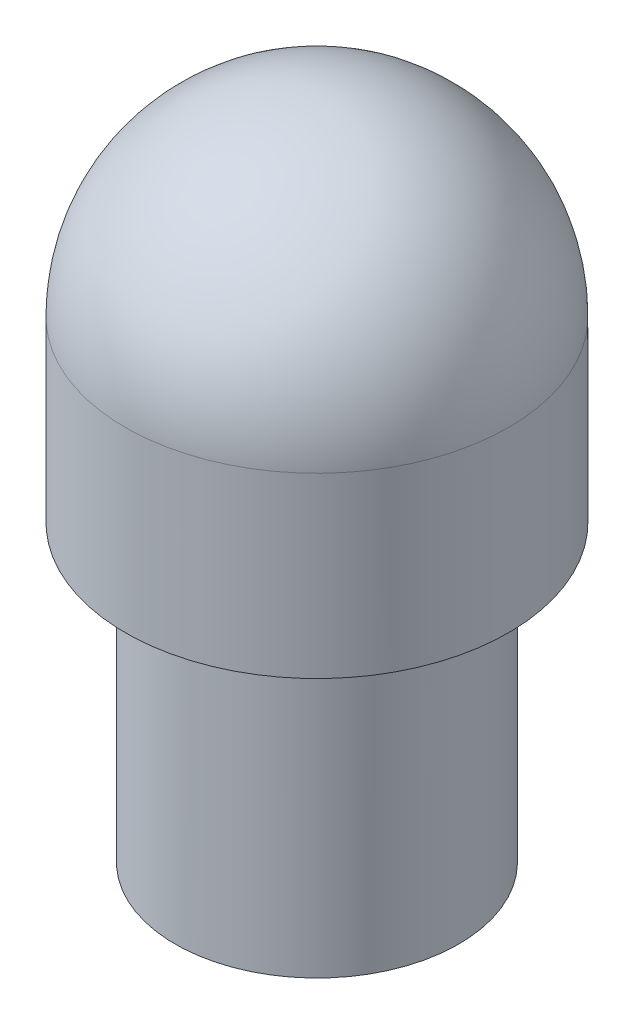
ISO-10303-21;
HEADER;
FILE_DESCRIPTION(('STEP AP214'),'2;1');
FILE_NAME('part.step','',(''),(''),'','','');
FILE_SCHEMA(('AUTOMOTIVE_DESIGN { 1 0 10303 214 1 1 1 1 }'));
ENDSEC;
DATA;
#1=APPLICATION_CONTEXT('core data for automotive mechanical design processes');
#2=APPLICATION_PROTOCOL_DEFINITION('international standard','automotive_design',2000,#1);
#3=PRODUCT_CONTEXT('',#1,'mechanical');
#4=PRODUCT('Part','Part','',(#3));
#5=PRODUCT_RELATED_PRODUCT_CATEGORY('part','',(#4));
#6=PRODUCT_DEFINITION_FORMATION('','',#4);
#7=PRODUCT_DEFINITION_CONTEXT('part definition',#1,'design');
#8=PRODUCT_DEFINITION('design','',#6,#7);
#9=PRODUCT_DEFINITION_SHAPE('','',#8);
#10=(LENGTH_UNIT() NAMED_UNIT(*) SI_UNIT(.MILLI.,.METRE.));
#11=(NAMED_UNIT(*) PLANE_ANGLE_UNIT() SI_UNIT($,.RADIAN.));
#12=(NAMED_UNIT(*) SI_UNIT($,.STERADIAN.) SOLID_ANGLE_UNIT());
#13=UNCERTAINTY_MEASURE_WITH_UNIT(LENGTH_MEASURE(1.E-05),#10,'distance_accuracy_value','');
#14=(GEOMETRIC_REPRESENTATION_CONTEXT(3) GLOBAL_UNCERTAINTY_ASSIGNED_CONTEXT((#13)) GLOBAL_UNIT_ASSIGNED_CONTEXT((#10,
#11,#12)) REPRESENTATION_CONTEXT('',''));
#15=CARTESIAN_POINT('',(0.,0.,0.));
#16=DIRECTION('',(0.,0.,1.));
#17=DIRECTION('',(1.,0.,0.));
#18=AXIS2_PLACEMENT_3D('',#15,#16,#17);
#19=CARTESIAN_POINT('',(-3.899,25.4,0.));
#20=DIRECTION('',(0.,1.,0.));
#21=DIRECTION('',(0.,0.,1.));
#22=AXIS2_PLACEMENT_3D('',#19,#20,#21);
#23=PLANE('',#22);
#24=CARTESIAN_POINT('',(0.,25.4,0.));
#25=DIRECTION('',(0.,-1.,0.));
#26=DIRECTION('',(0.,0.,-1.));
#27=AXIS2_PLACEMENT_3D('',#24,#25,#26);
#28=CIRCLE('',#27,3.5);
#29=CARTESIAN_POINT('',(0.,25.4,-3.5));
#30=VERTEX_POINT('',#29);
#31=EDGE_CURVE('E80',#30,#30,#28,.T.);
#32=ORIENTED_EDGE('',*,*,#31,.F.);
#33=EDGE_LOOP('',(#32));
#34=FACE_BOUND('',#33,.T.);
#35=CARTESIAN_POINT('',(0.,25.4,0.));
#36=DIRECTION('',(0.,-1.,0.));
#37=DIRECTION('',(0.,0.,-1.));
#38=AXIS2_PLACEMENT_3D('',#35,#36,#37);
#39=CIRCLE('',#38,3.899);
#40=CARTESIAN_POINT('',(0.,25.4,-3.899));
#41=VERTEX_POINT('',#40);
#42=EDGE_CURVE('E70',#41,#41,#39,.T.);
#43=ORIENTED_EDGE('',*,*,#42,.T.);
#44=EDGE_LOOP('',(#43));
#45=FACE_BOUND('',#44,.T.);
#46=ADVANCED_FACE('F50',(#34,#45),#23,.F.);
#47=CARTESIAN_POINT('',(0.,38.3921,0.));
#48=DIRECTION('',(0.,-1.,0.));
#49=DIRECTION('',(1.,0.,0.));
#50=AXIS2_PLACEMENT_3D('',#47,#48,#49);
#51=SPHERICAL_SURFACE('',#50,5.2705);
#52=CARTESIAN_POINT('',(0.,38.3921,0.));
#53=DIRECTION('',(0.,-1.,0.));
#54=DIRECTION('',(0.,0.,-1.));
#55=AXIS2_PLACEMENT_3D('',#52,#53,#54);
#56=CIRCLE('',#55,5.2705);
#57=CARTESIAN_POINT('',(0.,38.3921,-5.2705));
#58=VERTEX_POINT('',#57);
#59=EDGE_CURVE('E85',#58,#58,#56,.T.);
#60=ORIENTED_EDGE('',*,*,#59,.F.);
#61=EDGE_LOOP('',(#60));
#62=FACE_BOUND('',#61,.T.);
#63=ADVANCED_FACE('F101',(#62),#51,.T.);
#64=CARTESIAN_POINT('',(0.,25.4,0.));
#65=DIRECTION('',(0.,-1.,0.));
#66=DIRECTION('',(0.,0.,-1.));
#67=AXIS2_PLACEMENT_3D('',#64,#65,#66);
#68=CYLINDRICAL_SURFACE('',#67,5.2705);
#69=CARTESIAN_POINT('',(0.,33.5026,0.));
#70=DIRECTION('',(0.,-1.,0.));
#71=DIRECTION('',(0.,0.,-1.));
#72=AXIS2_PLACEMENT_3D('',#69,#70,#71);
#73=CIRCLE('',#72,5.2705);
#74=CARTESIAN_POINT('',(0.,33.5026,-5.2705));
#75=VERTEX_POINT('',#74);
#76=EDGE_CURVE('E74',#75,#75,#73,.T.);
#77=ORIENTED_EDGE('',*,*,#76,.F.);
#78=EDGE_LOOP('',(#77));
#79=FACE_BOUND('',#78,.T.);
#80=ORIENTED_EDGE('',*,*,#59,.T.);
#81=EDGE_LOOP('',(#80));
#82=FACE_BOUND('',#81,.T.);
#83=ADVANCED_FACE('F107',(#79,#82),#68,.T.);
#84=CARTESIAN_POINT('',(-5.2705,33.5026,0.));
#85=DIRECTION('',(0.,1.,0.));
#86=DIRECTION('',(0.,0.,1.));
#87=AXIS2_PLACEMENT_3D('',#84,#85,#86);
#88=PLANE('',#87);
#89=CARTESIAN_POINT('',(0.,33.5026,0.));
#90=DIRECTION('',(0.,1.,0.));
#91=DIRECTION('',(0.,0.,1.));
#92=AXIS2_PLACEMENT_3D('',#89,#90,#91);
#93=CIRCLE('',#92,4.661);
#94=CARTESIAN_POINT('',(0.,33.5026,4.661));
#95=VERTEX_POINT('',#94);
#96=EDGE_CURVE('E13',#95,#95,#93,.T.);
#97=ORIENTED_EDGE('',*,*,#96,.T.);
#98=EDGE_LOOP('',(#97));
#99=FACE_BOUND('',#98,.T.);
#100=ORIENTED_EDGE('',*,*,#76,.T.);
#101=EDGE_LOOP('',(#100));
#102=FACE_BOUND('',#101,.T.);
#103=ADVANCED_FACE('F115',(#99,#102),#88,.F.);
#104=CARTESIAN_POINT('',(0.,25.4,0.));
#105=DIRECTION('',(0.,-1.,0.));
#106=DIRECTION('',(0.,0.,-1.));
#107=AXIS2_PLACEMENT_3D('',#104,#105,#106);
#108=CYLINDRICAL_SURFACE('',#107,3.899);
#109=CARTESIAN_POINT('',(0.,32.7406,0.));
#110=DIRECTION('',(0.,1.,0.));
#111=DIRECTION('',(0.,0.,1.));
#112=AXIS2_PLACEMENT_3D('',#109,#110,#111);
#113=CIRCLE('',#112,3.899);
#114=CARTESIAN_POINT('',(0.,32.7406,3.899));
#115=VERTEX_POINT('',#114);
#116=EDGE_CURVE('E57',#115,#115,#113,.F.);
#117=ORIENTED_EDGE('',*,*,#116,.T.);
#118=EDGE_LOOP('',(#117));
#119=FACE_BOUND('',#118,.T.);
#120=ORIENTED_EDGE('',*,*,#42,.F.);
#121=EDGE_LOOP('',(#120));
#122=FACE_BOUND('',#121,.T.);
#123=ADVANCED_FACE('F90',(#119,#122),#108,.T.);
#124=CARTESIAN_POINT('',(0.,27.9,0.));
#125=DIRECTION('',(0.,-1.,0.));
#126=DIRECTION('',(0.,0.,-1.));
#127=AXIS2_PLACEMENT_3D('',#124,#125,#126);
#128=PLANE('',#127);
#129=CARTESIAN_POINT('',(0.,27.9,0.));
#130=DIRECTION('',(0.,-1.,0.));
#131=DIRECTION('',(0.,0.,-1.));
#132=AXIS2_PLACEMENT_3D('',#129,#130,#131);
#133=CIRCLE('',#132,3.5);
#134=CARTESIAN_POINT('',(0.,27.9,-3.5));
#135=VERTEX_POINT('',#134);
#136=EDGE_CURVE('E77',#135,#135,#133,.T.);
#137=ORIENTED_EDGE('',*,*,#136,.T.);
#138=EDGE_LOOP('',(#137));
#139=FACE_BOUND('',#138,.T.);
#140=CARTESIAN_POINT('',(0.,27.9,0.));
#141=DIRECTION('',(0.,-1.,0.));
#142=DIRECTION('',(0.,0.,-1.));
#143=AXIS2_PLACEMENT_3D('',#140,#141,#142);
#144=CIRCLE('',#143,2.99999999999999);
#145=CARTESIAN_POINT('',(0.,27.9,-2.99999999999999));
#146=VERTEX_POINT('',#145);
#147=EDGE_CURVE('E71',#146,#146,#144,.F.);
#148=ORIENTED_EDGE('',*,*,#147,.T.);
#149=EDGE_LOOP('',(#148));
#150=FACE_BOUND('',#149,.T.);
#151=ADVANCED_FACE('F114',(#139,#150),#128,.T.);
#152=CARTESIAN_POINT('',(0.,27.9,0.));
#153=DIRECTION('',(0.,-1.,0.));
#154=DIRECTION('',(0.,0.,-1.));
#155=AXIS2_PLACEMENT_3D('',#152,#153,#154);
#156=CYLINDRICAL_SURFACE('',#155,3.5);
#157=ORIENTED_EDGE('',*,*,#136,.F.);
#158=EDGE_LOOP('',(#157));
#159=FACE_BOUND('',#158,.T.);
#160=ORIENTED_EDGE('',*,*,#31,.T.);
#161=EDGE_LOOP('',(#160));
#162=FACE_BOUND('',#161,.T.);
#163=ADVANCED_FACE('F64',(#159,#162),#156,.F.);
#164=CARTESIAN_POINT('',(0.,41.402,0.));
#165=DIRECTION('',(0.,-1.,0.));
#166=DIRECTION('',(0.,0.,-1.));
#167=AXIS2_PLACEMENT_3D('',#164,#165,#166);
#168=CONICAL_SURFACE('',#167,3.,1.02974425867665);
#169=CARTESIAN_POINT('',(0.,43.2045818570827,0.));
#170=VERTEX_POINT('',#169);
#171=VERTEX_LOOP('',#170);
#172=FACE_BOUND('',#171,.T.);
#173=CARTESIAN_POINT('',(0.,41.402,0.));
#174=DIRECTION('',(0.,-1.,0.));
#175=DIRECTION('',(0.,0.,-1.));
#176=AXIS2_PLACEMENT_3D('',#173,#174,#175);
#177=CIRCLE('',#176,3.);
#178=CARTESIAN_POINT('',(0.,41.402,-3.));
#179=VERTEX_POINT('',#178);
#180=EDGE_CURVE('E68',#179,#179,#177,.T.);
#181=ORIENTED_EDGE('',*,*,#180,.T.);
#182=EDGE_LOOP('',(#181));
#183=FACE_BOUND('',#182,.T.);
#184=ADVANCED_FACE('F60',(#172,#183),#168,.F.);
#185=CARTESIAN_POINT('',(0.,25.4,0.));
#186=DIRECTION('',(0.,-1.,0.));
#187=DIRECTION('',(0.,0.,-1.));
#188=AXIS2_PLACEMENT_3D('',#185,#186,#187);
#189=CYLINDRICAL_SURFACE('',#188,2.99999999999999);
#190=ORIENTED_EDGE('',*,*,#180,.F.);
#191=EDGE_LOOP('',(#190));
#192=FACE_BOUND('',#191,.T.);
#193=ORIENTED_EDGE('',*,*,#147,.F.);
#194=EDGE_LOOP('',(#193));
#195=FACE_BOUND('',#194,.T.);
#196=ADVANCED_FACE('F63',(#192,#195),#189,.F.);
#197=CARTESIAN_POINT('',(0.,32.7406,0.));
#198=DIRECTION('',(0.,1.,0.));
#199=DIRECTION('',(0.,0.,1.));
#200=AXIS2_PLACEMENT_3D('',#197,#198,#199);
#201=TOROIDAL_SURFACE('',#200,4.661,0.762);
#202=ORIENTED_EDGE('',*,*,#96,.F.);
#203=EDGE_LOOP('',(#202));
#204=FACE_BOUND('',#203,.T.);
#205=ORIENTED_EDGE('',*,*,#116,.F.);
#206=EDGE_LOOP('',(#205));
#207=FACE_BOUND('',#206,.T.);
#208=ADVANCED_FACE('F52',(#204,#207),#201,.F.);
#209=CLOSED_SHELL('',(#46,#63,#83,#103,#123,#151,#163,#184,#196,#208));
#210=MANIFOLD_SOLID_BREP('B2',#209);
#211=ADVANCED_BREP_SHAPE_REPRESENTATION('',(#18,#210),#14);
#212=SHAPE_DEFINITION_REPRESENTATION(#9,#211);
ENDSEC;
END-ISO-10303-21;
